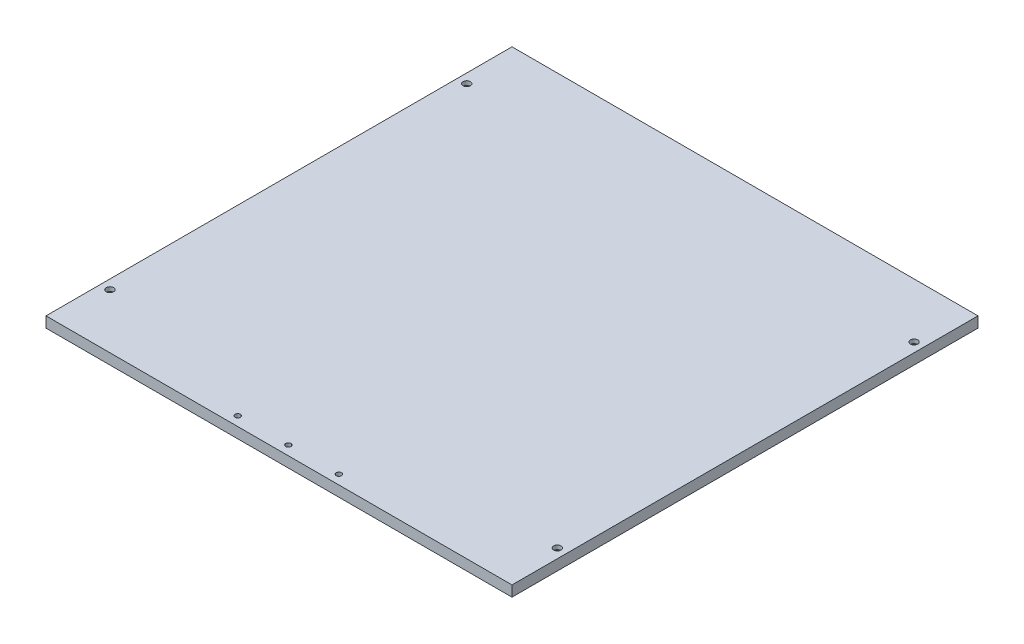
ISO-10303-21;
HEADER;
FILE_DESCRIPTION(('STEP AP214'),'2;1');
FILE_NAME('part.step','',(''),(''),'','','');
FILE_SCHEMA(('AUTOMOTIVE_DESIGN { 1 0 10303 214 1 1 1 1 }'));
ENDSEC;
DATA;
#1=APPLICATION_CONTEXT('core data for automotive mechanical design processes');
#2=APPLICATION_PROTOCOL_DEFINITION('international standard','automotive_design',2000,#1);
#3=PRODUCT_CONTEXT('',#1,'mechanical');
#4=PRODUCT('Part','Part','',(#3));
#5=PRODUCT_RELATED_PRODUCT_CATEGORY('part','',(#4));
#6=PRODUCT_DEFINITION_FORMATION('','',#4);
#7=PRODUCT_DEFINITION_CONTEXT('part definition',#1,'design');
#8=PRODUCT_DEFINITION('design','',#6,#7);
#9=PRODUCT_DEFINITION_SHAPE('','',#8);
#10=(LENGTH_UNIT() NAMED_UNIT(*) SI_UNIT(.MILLI.,.METRE.));
#11=(NAMED_UNIT(*) PLANE_ANGLE_UNIT() SI_UNIT($,.RADIAN.));
#12=(NAMED_UNIT(*) SI_UNIT($,.STERADIAN.) SOLID_ANGLE_UNIT());
#13=UNCERTAINTY_MEASURE_WITH_UNIT(LENGTH_MEASURE(1.E-05),#10,'distance_accuracy_value','');
#14=(GEOMETRIC_REPRESENTATION_CONTEXT(3) GLOBAL_UNCERTAINTY_ASSIGNED_CONTEXT((#13)) GLOBAL_UNIT_ASSIGNED_CONTEXT((#10,
#11,#12)) REPRESENTATION_CONTEXT('',''));
#15=CARTESIAN_POINT('',(0.,0.,0.));
#16=DIRECTION('',(0.,0.,1.));
#17=DIRECTION('',(1.,0.,0.));
#18=AXIS2_PLACEMENT_3D('',#15,#16,#17);
#19=CARTESIAN_POINT('',(7.,8.,-309.));
#20=DIRECTION('',(0.,-1.,0.));
#21=DIRECTION('',(0.,0.,-1.));
#22=AXIS2_PLACEMENT_3D('',#19,#20,#21);
#23=CYLINDRICAL_SURFACE('',#22,2.);
#24=CARTESIAN_POINT('',(7.,0.,-309.));
#25=DIRECTION('',(0.,1.,0.));
#26=DIRECTION('',(0.,0.,1.));
#27=AXIS2_PLACEMENT_3D('',#24,#25,#26);
#28=CIRCLE('',#27,2.);
#29=CARTESIAN_POINT('',(7.,0.,-307.));
#30=VERTEX_POINT('',#29);
#31=EDGE_CURVE('E110',#30,#30,#28,.T.);
#32=ORIENTED_EDGE('',*,*,#31,.F.);
#33=EDGE_LOOP('',(#32));
#34=FACE_BOUND('',#33,.T.);
#35=CARTESIAN_POINT('',(7.,5.,-309.));
#36=DIRECTION('',(0.,1.,0.));
#37=DIRECTION('',(0.,0.,1.));
#38=AXIS2_PLACEMENT_3D('',#35,#36,#37);
#39=CIRCLE('',#38,2.);
#40=CARTESIAN_POINT('',(7.,5.,-307.));
#41=VERTEX_POINT('',#40);
#42=EDGE_CURVE('E43',#41,#41,#39,.T.);
#43=ORIENTED_EDGE('',*,*,#42,.T.);
#44=EDGE_LOOP('',(#43));
#45=FACE_BOUND('',#44,.T.);
#46=ADVANCED_FACE('F39',(#34,#45),#23,.F.);
#47=CARTESIAN_POINT('',(343.,8.,-309.));
#48=DIRECTION('',(0.,-1.,0.));
#49=DIRECTION('',(0.,0.,-1.));
#50=AXIS2_PLACEMENT_3D('',#47,#48,#49);
#51=CYLINDRICAL_SURFACE('',#50,2.);
#52=CARTESIAN_POINT('',(343.,0.,-309.));
#53=DIRECTION('',(0.,1.,0.));
#54=DIRECTION('',(0.,0.,1.));
#55=AXIS2_PLACEMENT_3D('',#52,#53,#54);
#56=CIRCLE('',#55,2.);
#57=CARTESIAN_POINT('',(343.,0.,-307.));
#58=VERTEX_POINT('',#57);
#59=EDGE_CURVE('E157',#58,#58,#56,.T.);
#60=ORIENTED_EDGE('',*,*,#59,.F.);
#61=EDGE_LOOP('',(#60));
#62=FACE_BOUND('',#61,.T.);
#63=CARTESIAN_POINT('',(343.,5.,-309.));
#64=DIRECTION('',(0.,1.,0.));
#65=DIRECTION('',(0.,0.,1.));
#66=AXIS2_PLACEMENT_3D('',#63,#64,#65);
#67=CIRCLE('',#66,2.);
#68=CARTESIAN_POINT('',(343.,5.,-307.));
#69=VERTEX_POINT('',#68);
#70=EDGE_CURVE('E122',#69,#69,#67,.T.);
#71=ORIENTED_EDGE('',*,*,#70,.T.);
#72=EDGE_LOOP('',(#71));
#73=FACE_BOUND('',#72,.T.);
#74=ADVANCED_FACE('F169',(#62,#73),#51,.F.);
#75=CARTESIAN_POINT('',(7.,8.,-41.));
#76=DIRECTION('',(0.,-1.,0.));
#77=DIRECTION('',(0.,0.,-1.));
#78=AXIS2_PLACEMENT_3D('',#75,#76,#77);
#79=CYLINDRICAL_SURFACE('',#78,2.);
#80=CARTESIAN_POINT('',(7.,0.,-41.));
#81=DIRECTION('',(0.,1.,0.));
#82=DIRECTION('',(0.,0.,1.));
#83=AXIS2_PLACEMENT_3D('',#80,#81,#82);
#84=CIRCLE('',#83,2.);
#85=CARTESIAN_POINT('',(7.,0.,-39.));
#86=VERTEX_POINT('',#85);
#87=EDGE_CURVE('E131',#86,#86,#84,.T.);
#88=ORIENTED_EDGE('',*,*,#87,.F.);
#89=EDGE_LOOP('',(#88));
#90=FACE_BOUND('',#89,.T.);
#91=CARTESIAN_POINT('',(7.,5.,-41.));
#92=DIRECTION('',(0.,1.,0.));
#93=DIRECTION('',(0.,0.,1.));
#94=AXIS2_PLACEMENT_3D('',#91,#92,#93);
#95=CIRCLE('',#94,2.);
#96=CARTESIAN_POINT('',(7.,5.,-39.));
#97=VERTEX_POINT('',#96);
#98=EDGE_CURVE('E119',#97,#97,#95,.T.);
#99=ORIENTED_EDGE('',*,*,#98,.T.);
#100=EDGE_LOOP('',(#99));
#101=FACE_BOUND('',#100,.T.);
#102=ADVANCED_FACE('F175',(#90,#101),#79,.F.);
#103=CARTESIAN_POINT('',(343.,8.,-41.));
#104=DIRECTION('',(0.,-1.,0.));
#105=DIRECTION('',(0.,0.,-1.));
#106=AXIS2_PLACEMENT_3D('',#103,#104,#105);
#107=CYLINDRICAL_SURFACE('',#106,2.);
#108=CARTESIAN_POINT('',(343.,0.,-41.));
#109=DIRECTION('',(0.,1.,0.));
#110=DIRECTION('',(0.,0.,1.));
#111=AXIS2_PLACEMENT_3D('',#108,#109,#110);
#112=CIRCLE('',#111,2.);
#113=CARTESIAN_POINT('',(343.,0.,-39.));
#114=VERTEX_POINT('',#113);
#115=EDGE_CURVE('E127',#114,#114,#112,.T.);
#116=ORIENTED_EDGE('',*,*,#115,.F.);
#117=EDGE_LOOP('',(#116));
#118=FACE_BOUND('',#117,.T.);
#119=CARTESIAN_POINT('',(343.,5.,-41.));
#120=DIRECTION('',(0.,1.,0.));
#121=DIRECTION('',(0.,0.,1.));
#122=AXIS2_PLACEMENT_3D('',#119,#120,#121);
#123=CIRCLE('',#122,2.);
#124=CARTESIAN_POINT('',(343.,5.,-39.));
#125=VERTEX_POINT('',#124);
#126=EDGE_CURVE('E116',#125,#125,#123,.T.);
#127=ORIENTED_EDGE('',*,*,#126,.T.);
#128=EDGE_LOOP('',(#127));
#129=FACE_BOUND('',#128,.T.);
#130=ADVANCED_FACE('F182',(#118,#129),#107,.F.);
#131=CARTESIAN_POINT('',(0.,8.,0.));
#132=DIRECTION('',(0.,-1.,0.));
#133=DIRECTION('',(0.,0.,-1.));
#134=AXIS2_PLACEMENT_3D('',#131,#132,#133);
#135=PLANE('',#134);
#136=CARTESIAN_POINT('',(343.,8.,-309.));
#137=DIRECTION('',(0.,1.,0.));
#138=DIRECTION('',(0.,0.,1.));
#139=AXIS2_PLACEMENT_3D('',#136,#137,#138);
#140=CIRCLE('',#139,2.74999999999998);
#141=CARTESIAN_POINT('',(343.,8.,-306.25));
#142=VERTEX_POINT('',#141);
#143=EDGE_CURVE('E395',#142,#142,#140,.T.);
#144=ORIENTED_EDGE('',*,*,#143,.F.);
#145=EDGE_LOOP('',(#144));
#146=FACE_BOUND('',#145,.T.);
#147=CARTESIAN_POINT('',(7.,8.,-41.));
#148=DIRECTION('',(0.,1.,0.));
#149=DIRECTION('',(0.,0.,1.));
#150=AXIS2_PLACEMENT_3D('',#147,#148,#149);
#151=CIRCLE('',#150,2.75);
#152=CARTESIAN_POINT('',(7.,8.,-38.25));
#153=VERTEX_POINT('',#152);
#154=EDGE_CURVE('E401',#153,#153,#151,.T.);
#155=ORIENTED_EDGE('',*,*,#154,.F.);
#156=EDGE_LOOP('',(#155));
#157=FACE_BOUND('',#156,.T.);
#158=CARTESIAN_POINT('',(343.,8.,-41.));
#159=DIRECTION('',(0.,1.,0.));
#160=DIRECTION('',(0.,0.,1.));
#161=AXIS2_PLACEMENT_3D('',#158,#159,#160);
#162=CIRCLE('',#161,2.74999999999998);
#163=CARTESIAN_POINT('',(343.,8.,-38.25));
#164=VERTEX_POINT('',#163);
#165=EDGE_CURVE('E389',#164,#164,#162,.T.);
#166=ORIENTED_EDGE('',*,*,#165,.F.);
#167=EDGE_LOOP('',(#166));
#168=FACE_BOUND('',#167,.T.);
#169=CARTESIAN_POINT('',(7.,8.,-309.));
#170=DIRECTION('',(0.,1.,0.));
#171=DIRECTION('',(0.,0.,1.));
#172=AXIS2_PLACEMENT_3D('',#169,#170,#171);
#173=CIRCLE('',#172,2.75);
#174=CARTESIAN_POINT('',(7.,8.,-306.25));
#175=VERTEX_POINT('',#174);
#176=EDGE_CURVE('E139',#175,#175,#173,.T.);
#177=ORIENTED_EDGE('',*,*,#176,.F.);
#178=EDGE_LOOP('',(#177));
#179=FACE_BOUND('',#178,.T.);
#180=DIRECTION('',(0.,0.,1.));
#181=VECTOR('',#180,1.);
#182=CARTESIAN_POINT('',(0.,8.,0.));
#183=LINE('',#182,#181);
#184=CARTESIAN_POINT('',(0.,8.,-350.));
#185=VERTEX_POINT('',#184);
#186=CARTESIAN_POINT('',(0.,8.,0.));
#187=VERTEX_POINT('',#186);
#188=EDGE_CURVE('E94',#185,#187,#183,.T.);
#189=ORIENTED_EDGE('',*,*,#188,.T.);
#190=DIRECTION('',(1.,0.,0.));
#191=VECTOR('',#190,1.);
#192=CARTESIAN_POINT('',(0.,8.,0.));
#193=LINE('',#192,#191);
#194=CARTESIAN_POINT('',(350.,8.,0.));
#195=VERTEX_POINT('',#194);
#196=EDGE_CURVE('E88',#187,#195,#193,.T.);
#197=ORIENTED_EDGE('',*,*,#196,.T.);
#198=DIRECTION('',(0.,0.,-1.));
#199=VECTOR('',#198,1.);
#200=CARTESIAN_POINT('',(350.,8.,0.));
#201=LINE('',#200,#199);
#202=CARTESIAN_POINT('',(350.,8.,-350.));
#203=VERTEX_POINT('',#202);
#204=EDGE_CURVE('E92',#195,#203,#201,.T.);
#205=ORIENTED_EDGE('',*,*,#204,.T.);
#206=DIRECTION('',(-1.,0.,0.));
#207=VECTOR('',#206,1.);
#208=CARTESIAN_POINT('',(0.,8.,-350.));
#209=LINE('',#208,#207);
#210=EDGE_CURVE('E58',#203,#185,#209,.T.);
#211=ORIENTED_EDGE('',*,*,#210,.T.);
#212=EDGE_LOOP('',(#189,#197,#205,#211));
#213=FACE_BOUND('',#212,.T.);
#214=CARTESIAN_POINT('',(137.,8.,-7.));
#215=DIRECTION('',(0.,1.,0.));
#216=DIRECTION('',(0.,0.,1.));
#217=AXIS2_PLACEMENT_3D('',#214,#215,#216);
#218=CIRCLE('',#217,2.);
#219=CARTESIAN_POINT('',(137.,8.,-5.));
#220=VERTEX_POINT('',#219);
#221=EDGE_CURVE('E154',#220,#220,#218,.T.);
#222=ORIENTED_EDGE('',*,*,#221,.F.);
#223=EDGE_LOOP('',(#222));
#224=FACE_BOUND('',#223,.T.);
#225=CARTESIAN_POINT('',(175.,8.,-7.00000000000001));
#226=DIRECTION('',(0.,1.,0.));
#227=DIRECTION('',(0.,0.,1.));
#228=AXIS2_PLACEMENT_3D('',#225,#226,#227);
#229=CIRCLE('',#228,2.);
#230=CARTESIAN_POINT('',(175.,8.,-5.00000000000001));
#231=VERTEX_POINT('',#230);
#232=EDGE_CURVE('E148',#231,#231,#229,.T.);
#233=ORIENTED_EDGE('',*,*,#232,.F.);
#234=EDGE_LOOP('',(#233));
#235=FACE_BOUND('',#234,.T.);
#236=CARTESIAN_POINT('',(213.,8.,-7.00000000000001));
#237=DIRECTION('',(0.,1.,0.));
#238=DIRECTION('',(0.,0.,1.));
#239=AXIS2_PLACEMENT_3D('',#236,#237,#238);
#240=CIRCLE('',#239,2.);
#241=CARTESIAN_POINT('',(213.,8.,-5.00000000000002));
#242=VERTEX_POINT('',#241);
#243=EDGE_CURVE('E142',#242,#242,#240,.T.);
#244=ORIENTED_EDGE('',*,*,#243,.F.);
#245=EDGE_LOOP('',(#244));
#246=FACE_BOUND('',#245,.T.);
#247=ADVANCED_FACE('F89',(#146,#157,#168,#179,#213,#224,#235,#246),#135,.F.);
#248=CARTESIAN_POINT('',(0.,0.,0.));
#249=DIRECTION('',(0.,-1.,0.));
#250=DIRECTION('',(0.,0.,-1.));
#251=AXIS2_PLACEMENT_3D('',#248,#249,#250);
#252=PLANE('',#251);
#253=ORIENTED_EDGE('',*,*,#87,.T.);
#254=EDGE_LOOP('',(#253));
#255=FACE_BOUND('',#254,.T.);
#256=CARTESIAN_POINT('',(175.,0.,-7.00000000000001));
#257=DIRECTION('',(0.,1.,0.));
#258=DIRECTION('',(0.,0.,1.));
#259=AXIS2_PLACEMENT_3D('',#256,#257,#258);
#260=CIRCLE('',#259,2.);
#261=CARTESIAN_POINT('',(175.,0.,-5.00000000000001));
#262=VERTEX_POINT('',#261);
#263=EDGE_CURVE('E145',#262,#262,#260,.T.);
#264=ORIENTED_EDGE('',*,*,#263,.T.);
#265=EDGE_LOOP('',(#264));
#266=FACE_BOUND('',#265,.T.);
#267=ORIENTED_EDGE('',*,*,#59,.T.);
#268=EDGE_LOOP('',(#267));
#269=FACE_BOUND('',#268,.T.);
#270=DIRECTION('',(0.,0.,1.));
#271=VECTOR('',#270,1.);
#272=CARTESIAN_POINT('',(0.,0.,0.));
#273=LINE('',#272,#271);
#274=CARTESIAN_POINT('',(0.,0.,-350.));
#275=VERTEX_POINT('',#274);
#276=CARTESIAN_POINT('',(0.,0.,0.));
#277=VERTEX_POINT('',#276);
#278=EDGE_CURVE('E107',#275,#277,#273,.T.);
#279=ORIENTED_EDGE('',*,*,#278,.F.);
#280=DIRECTION('',(-1.,0.,0.));
#281=VECTOR('',#280,1.);
#282=CARTESIAN_POINT('',(0.,0.,-350.));
#283=LINE('',#282,#281);
#284=CARTESIAN_POINT('',(350.,0.,-350.));
#285=VERTEX_POINT('',#284);
#286=EDGE_CURVE('E81',#285,#275,#283,.T.);
#287=ORIENTED_EDGE('',*,*,#286,.F.);
#288=DIRECTION('',(0.,0.,-1.));
#289=VECTOR('',#288,1.);
#290=CARTESIAN_POINT('',(350.,0.,0.));
#291=LINE('',#290,#289);
#292=CARTESIAN_POINT('',(350.,0.,0.));
#293=VERTEX_POINT('',#292);
#294=EDGE_CURVE('E75',#293,#285,#291,.T.);
#295=ORIENTED_EDGE('',*,*,#294,.F.);
#296=DIRECTION('',(1.,0.,0.));
#297=VECTOR('',#296,1.);
#298=CARTESIAN_POINT('',(0.,0.,0.));
#299=LINE('',#298,#297);
#300=EDGE_CURVE('E98',#277,#293,#299,.T.);
#301=ORIENTED_EDGE('',*,*,#300,.F.);
#302=EDGE_LOOP('',(#279,#287,#295,#301));
#303=FACE_BOUND('',#302,.T.);
#304=ORIENTED_EDGE('',*,*,#31,.T.);
#305=EDGE_LOOP('',(#304));
#306=FACE_BOUND('',#305,.T.);
#307=CARTESIAN_POINT('',(137.,0.,-7.));
#308=DIRECTION('',(0.,1.,0.));
#309=DIRECTION('',(0.,0.,1.));
#310=AXIS2_PLACEMENT_3D('',#307,#308,#309);
#311=CIRCLE('',#310,2.);
#312=CARTESIAN_POINT('',(137.,0.,-5.));
#313=VERTEX_POINT('',#312);
#314=EDGE_CURVE('E151',#313,#313,#311,.T.);
#315=ORIENTED_EDGE('',*,*,#314,.T.);
#316=EDGE_LOOP('',(#315));
#317=FACE_BOUND('',#316,.T.);
#318=CARTESIAN_POINT('',(213.,0.,-7.00000000000001));
#319=DIRECTION('',(0.,1.,0.));
#320=DIRECTION('',(0.,0.,1.));
#321=AXIS2_PLACEMENT_3D('',#318,#319,#320);
#322=CIRCLE('',#321,2.);
#323=CARTESIAN_POINT('',(213.,0.,-5.00000000000002));
#324=VERTEX_POINT('',#323);
#325=EDGE_CURVE('E136',#324,#324,#322,.T.);
#326=ORIENTED_EDGE('',*,*,#325,.T.);
#327=EDGE_LOOP('',(#326));
#328=FACE_BOUND('',#327,.T.);
#329=ORIENTED_EDGE('',*,*,#115,.T.);
#330=EDGE_LOOP('',(#329));
#331=FACE_BOUND('',#330,.T.);
#332=ADVANCED_FACE('F165',(#255,#266,#269,#303,#306,#317,#328,#331),#252,.T.);
#333=CARTESIAN_POINT('',(0.,8.,0.));
#334=DIRECTION('',(1.,0.,0.));
#335=DIRECTION('',(0.,0.,-1.));
#336=AXIS2_PLACEMENT_3D('',#333,#334,#335);
#337=PLANE('',#336);
#338=ORIENTED_EDGE('',*,*,#278,.T.);
#339=DIRECTION('',(0.,-1.,0.));
#340=VECTOR('',#339,1.);
#341=CARTESIAN_POINT('',(0.,8.,0.));
#342=LINE('',#341,#340);
#343=EDGE_CURVE('E11',#187,#277,#342,.T.);
#344=ORIENTED_EDGE('',*,*,#343,.F.);
#345=ORIENTED_EDGE('',*,*,#188,.F.);
#346=DIRECTION('',(0.,-1.,0.));
#347=VECTOR('',#346,1.);
#348=CARTESIAN_POINT('',(0.,8.,-350.));
#349=LINE('',#348,#347);
#350=EDGE_CURVE('E103',#185,#275,#349,.T.);
#351=ORIENTED_EDGE('',*,*,#350,.T.);
#352=EDGE_LOOP('',(#338,#344,#345,#351));
#353=FACE_BOUND('',#352,.T.);
#354=ADVANCED_FACE('F41',(#353),#337,.F.);
#355=CARTESIAN_POINT('',(0.,8.,0.));
#356=DIRECTION('',(0.,0.,-1.));
#357=DIRECTION('',(-1.,0.,0.));
#358=AXIS2_PLACEMENT_3D('',#355,#356,#357);
#359=PLANE('',#358);
#360=ORIENTED_EDGE('',*,*,#300,.T.);
#361=DIRECTION('',(0.,-1.,0.));
#362=VECTOR('',#361,1.);
#363=CARTESIAN_POINT('',(350.,8.,0.));
#364=LINE('',#363,#362);
#365=EDGE_CURVE('E49',#195,#293,#364,.T.);
#366=ORIENTED_EDGE('',*,*,#365,.F.);
#367=ORIENTED_EDGE('',*,*,#196,.F.);
#368=ORIENTED_EDGE('',*,*,#343,.T.);
#369=EDGE_LOOP('',(#360,#366,#367,#368));
#370=FACE_BOUND('',#369,.T.);
#371=ADVANCED_FACE('F97',(#370),#359,.F.);
#372=CARTESIAN_POINT('',(350.,8.,0.));
#373=DIRECTION('',(-1.,0.,0.));
#374=DIRECTION('',(0.,0.,1.));
#375=AXIS2_PLACEMENT_3D('',#372,#373,#374);
#376=PLANE('',#375);
#377=ORIENTED_EDGE('',*,*,#294,.T.);
#378=DIRECTION('',(0.,-1.,0.));
#379=VECTOR('',#378,1.);
#380=CARTESIAN_POINT('',(350.,8.,-350.));
#381=LINE('',#380,#379);
#382=EDGE_CURVE('E99',#203,#285,#381,.T.);
#383=ORIENTED_EDGE('',*,*,#382,.F.);
#384=ORIENTED_EDGE('',*,*,#204,.F.);
#385=ORIENTED_EDGE('',*,*,#365,.T.);
#386=EDGE_LOOP('',(#377,#383,#384,#385));
#387=FACE_BOUND('',#386,.T.);
#388=ADVANCED_FACE('F101',(#387),#376,.F.);
#389=CARTESIAN_POINT('',(0.,8.,-350.));
#390=DIRECTION('',(0.,0.,1.));
#391=DIRECTION('',(1.,0.,0.));
#392=AXIS2_PLACEMENT_3D('',#389,#390,#391);
#393=PLANE('',#392);
#394=ORIENTED_EDGE('',*,*,#286,.T.);
#395=ORIENTED_EDGE('',*,*,#350,.F.);
#396=ORIENTED_EDGE('',*,*,#210,.F.);
#397=ORIENTED_EDGE('',*,*,#382,.T.);
#398=EDGE_LOOP('',(#394,#395,#396,#397));
#399=FACE_BOUND('',#398,.T.);
#400=ADVANCED_FACE('F187',(#399),#393,.F.);
#401=CARTESIAN_POINT('',(137.,8.,-7.));
#402=DIRECTION('',(0.,-1.,0.));
#403=DIRECTION('',(0.,0.,-1.));
#404=AXIS2_PLACEMENT_3D('',#401,#402,#403);
#405=CYLINDRICAL_SURFACE('',#404,2.);
#406=ORIENTED_EDGE('',*,*,#221,.T.);
#407=EDGE_LOOP('',(#406));
#408=FACE_BOUND('',#407,.T.);
#409=ORIENTED_EDGE('',*,*,#314,.F.);
#410=EDGE_LOOP('',(#409));
#411=FACE_BOUND('',#410,.T.);
#412=ADVANCED_FACE('F190',(#408,#411),#405,.F.);
#413=CARTESIAN_POINT('',(175.,8.,-7.00000000000001));
#414=DIRECTION('',(0.,-1.,0.));
#415=DIRECTION('',(0.,0.,-1.));
#416=AXIS2_PLACEMENT_3D('',#413,#414,#415);
#417=CYLINDRICAL_SURFACE('',#416,2.);
#418=ORIENTED_EDGE('',*,*,#232,.T.);
#419=EDGE_LOOP('',(#418));
#420=FACE_BOUND('',#419,.T.);
#421=ORIENTED_EDGE('',*,*,#263,.F.);
#422=EDGE_LOOP('',(#421));
#423=FACE_BOUND('',#422,.T.);
#424=ADVANCED_FACE('F329',(#420,#423),#417,.F.);
#425=CARTESIAN_POINT('',(213.,8.,-7.00000000000001));
#426=DIRECTION('',(0.,-1.,0.));
#427=DIRECTION('',(0.,0.,-1.));
#428=AXIS2_PLACEMENT_3D('',#425,#426,#427);
#429=CYLINDRICAL_SURFACE('',#428,2.);
#430=ORIENTED_EDGE('',*,*,#243,.T.);
#431=EDGE_LOOP('',(#430));
#432=FACE_BOUND('',#431,.T.);
#433=ORIENTED_EDGE('',*,*,#325,.F.);
#434=EDGE_LOOP('',(#433));
#435=FACE_BOUND('',#434,.T.);
#436=ADVANCED_FACE('F226',(#432,#435),#429,.F.);
#437=CARTESIAN_POINT('',(343.,5.,-41.));
#438=DIRECTION('',(0.,1.,0.));
#439=DIRECTION('',(0.,0.,1.));
#440=AXIS2_PLACEMENT_3D('',#437,#438,#439);
#441=CYLINDRICAL_SURFACE('',#440,2.74999999999998);
#442=CARTESIAN_POINT('',(343.,5.,-41.));
#443=DIRECTION('',(0.,1.,0.));
#444=DIRECTION('',(0.,0.,1.));
#445=AXIS2_PLACEMENT_3D('',#442,#443,#444);
#446=CIRCLE('',#445,2.74999999999998);
#447=CARTESIAN_POINT('',(343.,5.,-38.25));
#448=VERTEX_POINT('',#447);
#449=EDGE_CURVE('E388',#448,#448,#446,.T.);
#450=ORIENTED_EDGE('',*,*,#449,.F.);
#451=EDGE_LOOP('',(#450));
#452=FACE_BOUND('',#451,.T.);
#453=ORIENTED_EDGE('',*,*,#165,.T.);
#454=EDGE_LOOP('',(#453));
#455=FACE_BOUND('',#454,.T.);
#456=ADVANCED_FACE('F221',(#452,#455),#441,.F.);
#457=CARTESIAN_POINT('',(343.,5.,-41.));
#458=DIRECTION('',(0.,1.,0.));
#459=DIRECTION('',(0.,0.,1.));
#460=AXIS2_PLACEMENT_3D('',#457,#458,#459);
#461=PLANE('',#460);
#462=ORIENTED_EDGE('',*,*,#126,.F.);
#463=EDGE_LOOP('',(#462));
#464=FACE_BOUND('',#463,.T.);
#465=ORIENTED_EDGE('',*,*,#449,.T.);
#466=EDGE_LOOP('',(#465));
#467=FACE_BOUND('',#466,.T.);
#468=ADVANCED_FACE('F225',(#464,#467),#461,.T.);
#469=CARTESIAN_POINT('',(7.,5.,-41.));
#470=DIRECTION('',(0.,1.,0.));
#471=DIRECTION('',(0.,0.,1.));
#472=AXIS2_PLACEMENT_3D('',#469,#470,#471);
#473=CYLINDRICAL_SURFACE('',#472,2.75);
#474=CARTESIAN_POINT('',(7.,5.,-41.));
#475=DIRECTION('',(0.,1.,0.));
#476=DIRECTION('',(0.,0.,1.));
#477=AXIS2_PLACEMENT_3D('',#474,#475,#476);
#478=CIRCLE('',#477,2.75);
#479=CARTESIAN_POINT('',(7.,5.,-38.25));
#480=VERTEX_POINT('',#479);
#481=EDGE_CURVE('E392',#480,#480,#478,.T.);
#482=ORIENTED_EDGE('',*,*,#481,.F.);
#483=EDGE_LOOP('',(#482));
#484=FACE_BOUND('',#483,.T.);
#485=ORIENTED_EDGE('',*,*,#154,.T.);
#486=EDGE_LOOP('',(#485));
#487=FACE_BOUND('',#486,.T.);
#488=ADVANCED_FACE('F236',(#484,#487),#473,.F.);
#489=CARTESIAN_POINT('',(7.,5.,-41.));
#490=DIRECTION('',(0.,1.,0.));
#491=DIRECTION('',(0.,0.,1.));
#492=AXIS2_PLACEMENT_3D('',#489,#490,#491);
#493=PLANE('',#492);
#494=ORIENTED_EDGE('',*,*,#98,.F.);
#495=EDGE_LOOP('',(#494));
#496=FACE_BOUND('',#495,.T.);
#497=ORIENTED_EDGE('',*,*,#481,.T.);
#498=EDGE_LOOP('',(#497));
#499=FACE_BOUND('',#498,.T.);
#500=ADVANCED_FACE('F245',(#496,#499),#493,.T.);
#501=CARTESIAN_POINT('',(343.,5.,-309.));
#502=DIRECTION('',(0.,1.,0.));
#503=DIRECTION('',(0.,0.,1.));
#504=AXIS2_PLACEMENT_3D('',#501,#502,#503);
#505=CYLINDRICAL_SURFACE('',#504,2.74999999999998);
#506=CARTESIAN_POINT('',(343.,5.,-309.));
#507=DIRECTION('',(0.,1.,0.));
#508=DIRECTION('',(0.,0.,1.));
#509=AXIS2_PLACEMENT_3D('',#506,#507,#508);
#510=CIRCLE('',#509,2.74999999999998);
#511=CARTESIAN_POINT('',(343.,5.,-306.25));
#512=VERTEX_POINT('',#511);
#513=EDGE_CURVE('E398',#512,#512,#510,.T.);
#514=ORIENTED_EDGE('',*,*,#513,.F.);
#515=EDGE_LOOP('',(#514));
#516=FACE_BOUND('',#515,.T.);
#517=ORIENTED_EDGE('',*,*,#143,.T.);
#518=EDGE_LOOP('',(#517));
#519=FACE_BOUND('',#518,.T.);
#520=ADVANCED_FACE('F254',(#516,#519),#505,.F.);
#521=CARTESIAN_POINT('',(343.,5.,-309.));
#522=DIRECTION('',(0.,1.,0.));
#523=DIRECTION('',(0.,0.,1.));
#524=AXIS2_PLACEMENT_3D('',#521,#522,#523);
#525=PLANE('',#524);
#526=ORIENTED_EDGE('',*,*,#70,.F.);
#527=EDGE_LOOP('',(#526));
#528=FACE_BOUND('',#527,.T.);
#529=ORIENTED_EDGE('',*,*,#513,.T.);
#530=EDGE_LOOP('',(#529));
#531=FACE_BOUND('',#530,.T.);
#532=ADVANCED_FACE('F263',(#528,#531),#525,.T.);
#533=CARTESIAN_POINT('',(7.,5.,-309.));
#534=DIRECTION('',(0.,1.,0.));
#535=DIRECTION('',(0.,0.,1.));
#536=AXIS2_PLACEMENT_3D('',#533,#534,#535);
#537=CYLINDRICAL_SURFACE('',#536,2.75);
#538=CARTESIAN_POINT('',(7.,5.,-309.));
#539=DIRECTION('',(0.,1.,0.));
#540=DIRECTION('',(0.,0.,1.));
#541=AXIS2_PLACEMENT_3D('',#538,#539,#540);
#542=CIRCLE('',#541,2.75);
#543=CARTESIAN_POINT('',(7.,5.,-306.25));
#544=VERTEX_POINT('',#543);
#545=EDGE_CURVE('E120',#544,#544,#542,.T.);
#546=ORIENTED_EDGE('',*,*,#545,.F.);
#547=EDGE_LOOP('',(#546));
#548=FACE_BOUND('',#547,.T.);
#549=ORIENTED_EDGE('',*,*,#176,.T.);
#550=EDGE_LOOP('',(#549));
#551=FACE_BOUND('',#550,.T.);
#552=ADVANCED_FACE('F272',(#548,#551),#537,.F.);
#553=CARTESIAN_POINT('',(7.,5.,-309.));
#554=DIRECTION('',(0.,1.,0.));
#555=DIRECTION('',(0.,0.,1.));
#556=AXIS2_PLACEMENT_3D('',#553,#554,#555);
#557=PLANE('',#556);
#558=ORIENTED_EDGE('',*,*,#42,.F.);
#559=EDGE_LOOP('',(#558));
#560=FACE_BOUND('',#559,.T.);
#561=ORIENTED_EDGE('',*,*,#545,.T.);
#562=EDGE_LOOP('',(#561));
#563=FACE_BOUND('',#562,.T.);
#564=ADVANCED_FACE('F281',(#560,#563),#557,.T.);
#565=CLOSED_SHELL('',(#46,#74,#102,#130,#247,#332,#354,#371,#388,#400,#412,#424,#436,#456,#468,
#488,#500,#520,#532,#552,#564));
#566=MANIFOLD_SOLID_BREP('B2',#565);
#567=ADVANCED_BREP_SHAPE_REPRESENTATION('',(#18,#566),#14);
#568=SHAPE_DEFINITION_REPRESENTATION(#9,#567);
ENDSEC;
END-ISO-10303-21;
